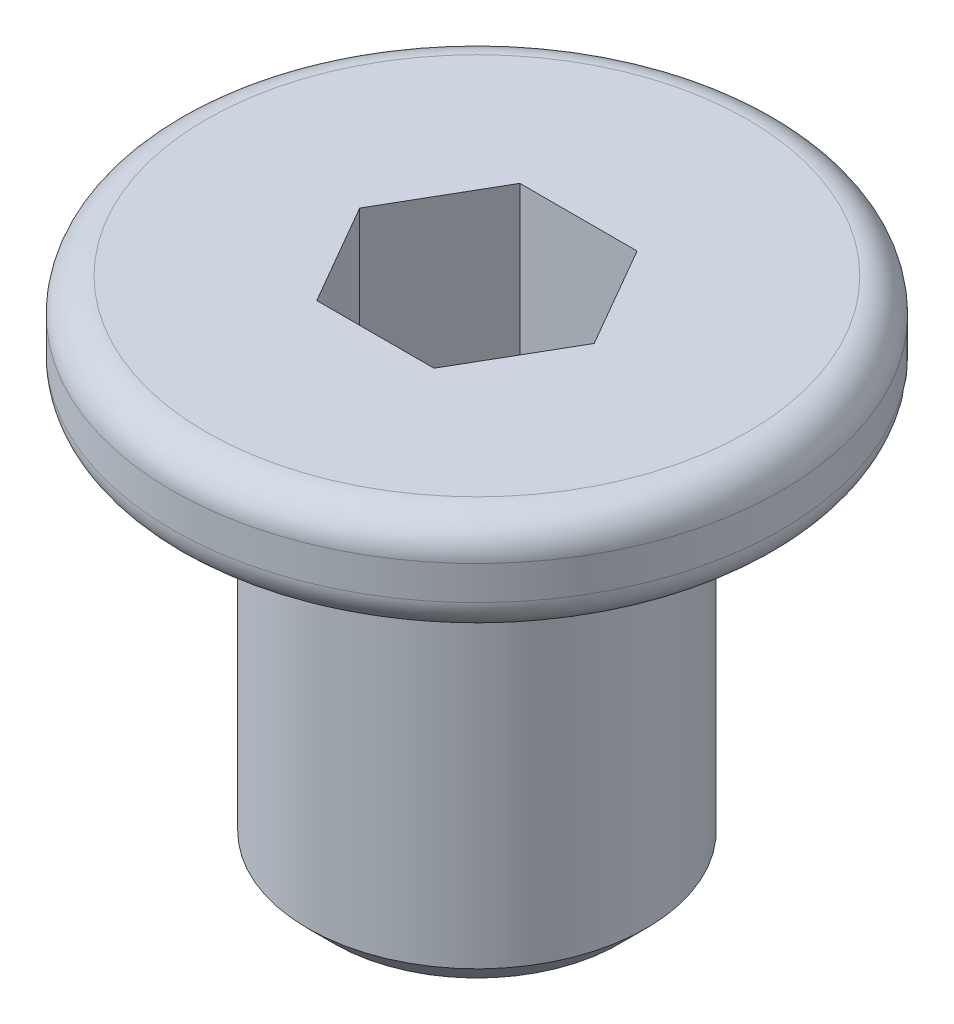
ISO-10303-21;
HEADER;
FILE_DESCRIPTION(('STEP AP214'),'2;1');
FILE_NAME('part.step','',(''),(''),'','','');
FILE_SCHEMA(('AUTOMOTIVE_DESIGN { 1 0 10303 214 1 1 1 1 }'));
ENDSEC;
DATA;
#1=APPLICATION_CONTEXT('core data for automotive mechanical design processes');
#2=APPLICATION_PROTOCOL_DEFINITION('international standard','automotive_design',2000,#1);
#3=PRODUCT_CONTEXT('',#1,'mechanical');
#4=PRODUCT('Part','Part','',(#3));
#5=PRODUCT_RELATED_PRODUCT_CATEGORY('part','',(#4));
#6=PRODUCT_DEFINITION_FORMATION('','',#4);
#7=PRODUCT_DEFINITION_CONTEXT('part definition',#1,'design');
#8=PRODUCT_DEFINITION('design','',#6,#7);
#9=PRODUCT_DEFINITION_SHAPE('','',#8);
#10=(LENGTH_UNIT() NAMED_UNIT(*) SI_UNIT(.MILLI.,.METRE.));
#11=(NAMED_UNIT(*) PLANE_ANGLE_UNIT() SI_UNIT($,.RADIAN.));
#12=(NAMED_UNIT(*) SI_UNIT($,.STERADIAN.) SOLID_ANGLE_UNIT());
#13=UNCERTAINTY_MEASURE_WITH_UNIT(LENGTH_MEASURE(1.E-05),#10,'distance_accuracy_value','');
#14=(GEOMETRIC_REPRESENTATION_CONTEXT(3) GLOBAL_UNCERTAINTY_ASSIGNED_CONTEXT((#13)) GLOBAL_UNIT_ASSIGNED_CONTEXT((#10,
#11,#12)) REPRESENTATION_CONTEXT('',''));
#15=CARTESIAN_POINT('',(0.,0.,0.));
#16=DIRECTION('',(0.,0.,1.));
#17=DIRECTION('',(1.,0.,0.));
#18=AXIS2_PLACEMENT_3D('',#15,#16,#17);
#19=CARTESIAN_POINT('',(0.,-1.,0.));
#20=DIRECTION('',(0.,1.,0.));
#21=DIRECTION('',(0.,0.,1.));
#22=AXIS2_PLACEMENT_3D('',#19,#20,#21);
#23=TOROIDAL_SURFACE('',#22,4.,0.5);
#24=CARTESIAN_POINT('',(0.,-1.5,0.));
#25=DIRECTION('',(0.,1.,0.));
#26=DIRECTION('',(0.,0.,1.));
#27=AXIS2_PLACEMENT_3D('',#24,#25,#26);
#28=CIRCLE('',#27,4.);
#29=CARTESIAN_POINT('',(0.,-1.5,4.));
#30=VERTEX_POINT('',#29);
#31=EDGE_CURVE('E188',#30,#30,#28,.T.);
#32=ORIENTED_EDGE('',*,*,#31,.T.);
#33=EDGE_LOOP('',(#32));
#34=FACE_BOUND('',#33,.T.);
#35=CARTESIAN_POINT('',(0.,-0.999999999999997,0.));
#36=DIRECTION('',(0.,1.,0.));
#37=DIRECTION('',(0.,0.,1.));
#38=AXIS2_PLACEMENT_3D('',#35,#36,#37);
#39=CIRCLE('',#38,4.5);
#40=CARTESIAN_POINT('',(0.,-0.999999999999997,4.5));
#41=VERTEX_POINT('',#40);
#42=EDGE_CURVE('E155',#41,#41,#39,.T.);
#43=ORIENTED_EDGE('',*,*,#42,.F.);
#44=EDGE_LOOP('',(#43));
#45=FACE_BOUND('',#44,.T.);
#46=ADVANCED_FACE('F43',(#34,#45),#23,.T.);
#47=CARTESIAN_POINT('',(-4.,-1.5,0.));
#48=DIRECTION('',(0.,-1.,0.));
#49=DIRECTION('',(0.,0.,-1.));
#50=AXIS2_PLACEMENT_3D('',#47,#48,#49);
#51=PLANE('',#50);
#52=CARTESIAN_POINT('',(0.,-1.5,0.));
#53=DIRECTION('',(0.,1.,0.));
#54=DIRECTION('',(0.,0.,1.));
#55=AXIS2_PLACEMENT_3D('',#52,#53,#54);
#56=CIRCLE('',#55,2.5);
#57=CARTESIAN_POINT('',(0.,-1.5,2.5));
#58=VERTEX_POINT('',#57);
#59=EDGE_CURVE('E185',#58,#58,#56,.T.);
#60=ORIENTED_EDGE('',*,*,#59,.T.);
#61=EDGE_LOOP('',(#60));
#62=FACE_BOUND('',#61,.T.);
#63=ORIENTED_EDGE('',*,*,#31,.F.);
#64=EDGE_LOOP('',(#63));
#65=FACE_BOUND('',#64,.T.);
#66=ADVANCED_FACE('F248',(#62,#65),#51,.T.);
#67=CARTESIAN_POINT('',(0.,2.75,0.));
#68=DIRECTION('',(0.,1.,0.));
#69=DIRECTION('',(0.,0.,1.));
#70=AXIS2_PLACEMENT_3D('',#67,#68,#69);
#71=CYLINDRICAL_SURFACE('',#70,2.5);
#72=CARTESIAN_POINT('',(0.,-7.1,0.));
#73=DIRECTION('',(0.,1.,0.));
#74=DIRECTION('',(0.,0.,1.));
#75=AXIS2_PLACEMENT_3D('',#72,#73,#74);
#76=CIRCLE('',#75,2.5);
#77=CARTESIAN_POINT('',(0.,-7.1,2.5));
#78=VERTEX_POINT('',#77);
#79=EDGE_CURVE('E182',#78,#78,#76,.T.);
#80=ORIENTED_EDGE('',*,*,#79,.T.);
#81=EDGE_LOOP('',(#80));
#82=FACE_BOUND('',#81,.T.);
#83=ORIENTED_EDGE('',*,*,#59,.F.);
#84=EDGE_LOOP('',(#83));
#85=FACE_BOUND('',#84,.T.);
#86=ADVANCED_FACE('F253',(#82,#85),#71,.T.);
#87=CARTESIAN_POINT('',(0.,-7.1,0.));
#88=DIRECTION('',(0.,1.,0.));
#89=DIRECTION('',(0.,0.,1.));
#90=AXIS2_PLACEMENT_3D('',#87,#88,#89);
#91=CONICAL_SURFACE('',#90,2.5,0.785398163397448);
#92=CARTESIAN_POINT('',(0.,-7.5,0.));
#93=DIRECTION('',(0.,1.,0.));
#94=DIRECTION('',(0.,0.,1.));
#95=AXIS2_PLACEMENT_3D('',#92,#93,#94);
#96=CIRCLE('',#95,2.1);
#97=CARTESIAN_POINT('',(0.,-7.5,2.1));
#98=VERTEX_POINT('',#97);
#99=EDGE_CURVE('E178',#98,#98,#96,.T.);
#100=ORIENTED_EDGE('',*,*,#99,.T.);
#101=EDGE_LOOP('',(#100));
#102=FACE_BOUND('',#101,.T.);
#103=ORIENTED_EDGE('',*,*,#79,.F.);
#104=EDGE_LOOP('',(#103));
#105=FACE_BOUND('',#104,.T.);
#106=ADVANCED_FACE('F279',(#102,#105),#91,.T.);
#107=CARTESIAN_POINT('',(-2.1,-7.5,0.));
#108=DIRECTION('',(0.,-1.,0.));
#109=DIRECTION('',(0.,0.,-1.));
#110=AXIS2_PLACEMENT_3D('',#107,#108,#109);
#111=PLANE('',#110);
#112=ORIENTED_EDGE('',*,*,#99,.F.);
#113=EDGE_LOOP('',(#112));
#114=FACE_BOUND('',#113,.T.);
#115=ADVANCED_FACE('F273',(#114),#111,.T.);
#116=CARTESIAN_POINT('',(-4.,0.,0.));
#117=DIRECTION('',(0.,1.,0.));
#118=DIRECTION('',(0.,0.,1.));
#119=AXIS2_PLACEMENT_3D('',#116,#117,#118);
#120=PLANE('',#119);
#121=DIRECTION('',(-1.,0.,0.));
#122=VECTOR('',#121,1.);
#123=CARTESIAN_POINT('',(-4.,0.,-1.5));
#124=LINE('',#123,#122);
#125=CARTESIAN_POINT('',(0.866025403784437,0.,-1.5));
#126=VERTEX_POINT('',#125);
#127=CARTESIAN_POINT('',(-0.866025403784439,0.,-1.5));
#128=VERTEX_POINT('',#127);
#129=EDGE_CURVE('E11',#126,#128,#124,.T.);
#130=ORIENTED_EDGE('',*,*,#129,.F.);
#131=DIRECTION('',(-0.500000000000001,0.,-0.866025403784438));
#132=VECTOR('',#131,1.);
#133=CARTESIAN_POINT('',(0.299038105676656,0.,-2.48205080756888));
#134=LINE('',#133,#132);
#135=CARTESIAN_POINT('',(1.73205080756888,0.,0.));
#136=VERTEX_POINT('',#135);
#137=EDGE_CURVE('E50',#136,#126,#134,.T.);
#138=ORIENTED_EDGE('',*,*,#137,.F.);
#139=DIRECTION('',(0.5,0.,-0.866025403784439));
#140=VECTOR('',#139,1.);
#141=CARTESIAN_POINT('',(0.299038105676658,0.,2.48205080756888));
#142=LINE('',#141,#140);
#143=CARTESIAN_POINT('',(0.866025403784438,0.,1.5));
#144=VERTEX_POINT('',#143);
#145=EDGE_CURVE('E193',#144,#136,#142,.T.);
#146=ORIENTED_EDGE('',*,*,#145,.F.);
#147=DIRECTION('',(1.,0.,0.));
#148=VECTOR('',#147,1.);
#149=CARTESIAN_POINT('',(-4.,0.,1.5));
#150=LINE('',#149,#148);
#151=CARTESIAN_POINT('',(-0.866025403784438,0.,1.5));
#152=VERTEX_POINT('',#151);
#153=EDGE_CURVE('E191',#152,#144,#150,.T.);
#154=ORIENTED_EDGE('',*,*,#153,.F.);
#155=DIRECTION('',(0.5,0.,0.866025403784439));
#156=VECTOR('',#155,1.);
#157=CARTESIAN_POINT('',(-2.29903810567666,0.,-0.982050807568876));
#158=LINE('',#157,#156);
#159=CARTESIAN_POINT('',(-1.73205080756888,0.,0.));
#160=VERTEX_POINT('',#159);
#161=EDGE_CURVE('E126',#160,#152,#158,.T.);
#162=ORIENTED_EDGE('',*,*,#161,.F.);
#163=DIRECTION('',(-0.5,0.,0.866025403784439));
#164=VECTOR('',#163,1.);
#165=CARTESIAN_POINT('',(-2.29903810567666,0.,0.982050807568876));
#166=LINE('',#165,#164);
#167=EDGE_CURVE('E196',#128,#160,#166,.T.);
#168=ORIENTED_EDGE('',*,*,#167,.F.);
#169=EDGE_LOOP('',(#130,#138,#146,#154,#162,#168));
#170=FACE_BOUND('',#169,.T.);
#171=CARTESIAN_POINT('',(0.,0.,0.));
#172=DIRECTION('',(0.,1.,0.));
#173=DIRECTION('',(0.,0.,1.));
#174=AXIS2_PLACEMENT_3D('',#171,#172,#173);
#175=CIRCLE('',#174,4.);
#176=CARTESIAN_POINT('',(0.,0.,4.));
#177=VERTEX_POINT('',#176);
#178=EDGE_CURVE('E172',#177,#177,#175,.T.);
#179=ORIENTED_EDGE('',*,*,#178,.T.);
#180=EDGE_LOOP('',(#179));
#181=FACE_BOUND('',#180,.T.);
#182=ADVANCED_FACE('F268',(#170,#181),#120,.T.);
#183=CARTESIAN_POINT('',(0.,-0.5,0.));
#184=DIRECTION('',(0.,1.,0.));
#185=DIRECTION('',(0.,0.,1.));
#186=AXIS2_PLACEMENT_3D('',#183,#184,#185);
#187=TOROIDAL_SURFACE('',#186,4.,0.5);
#188=CARTESIAN_POINT('',(0.,-0.500000000000003,0.));
#189=DIRECTION('',(0.,1.,0.));
#190=DIRECTION('',(0.,0.,1.));
#191=AXIS2_PLACEMENT_3D('',#188,#189,#190);
#192=CIRCLE('',#191,4.5);
#193=CARTESIAN_POINT('',(0.,-0.500000000000003,4.5));
#194=VERTEX_POINT('',#193);
#195=EDGE_CURVE('E169',#194,#194,#192,.T.);
#196=ORIENTED_EDGE('',*,*,#195,.T.);
#197=EDGE_LOOP('',(#196));
#198=FACE_BOUND('',#197,.T.);
#199=ORIENTED_EDGE('',*,*,#178,.F.);
#200=EDGE_LOOP('',(#199));
#201=FACE_BOUND('',#200,.T.);
#202=ADVANCED_FACE('F262',(#198,#201),#187,.T.);
#203=CARTESIAN_POINT('',(0.,2.75,0.));
#204=DIRECTION('',(0.,1.,0.));
#205=DIRECTION('',(0.,0.,1.));
#206=AXIS2_PLACEMENT_3D('',#203,#204,#205);
#207=CYLINDRICAL_SURFACE('',#206,4.5);
#208=ORIENTED_EDGE('',*,*,#42,.T.);
#209=EDGE_LOOP('',(#208));
#210=FACE_BOUND('',#209,.T.);
#211=ORIENTED_EDGE('',*,*,#195,.F.);
#212=EDGE_LOOP('',(#211));
#213=FACE_BOUND('',#212,.T.);
#214=ADVANCED_FACE('F259',(#210,#213),#207,.T.);
#215=CARTESIAN_POINT('',(0.,-3.,0.));
#216=DIRECTION('',(0.,1.,0.));
#217=DIRECTION('',(0.,0.,1.));
#218=AXIS2_PLACEMENT_3D('',#215,#216,#217);
#219=PLANE('',#218);
#220=DIRECTION('',(1.,0.,0.));
#221=VECTOR('',#220,1.);
#222=CARTESIAN_POINT('',(-0.866025403784438,-3.,1.5));
#223=LINE('',#222,#221);
#224=CARTESIAN_POINT('',(0.,-3.,1.5));
#225=VERTEX_POINT('',#224);
#226=CARTESIAN_POINT('',(0.866025403784438,-3.,1.5));
#227=VERTEX_POINT('',#226);
#228=EDGE_CURVE('E134',#225,#227,#223,.T.);
#229=ORIENTED_EDGE('',*,*,#228,.T.);
#230=DIRECTION('',(0.5,0.,-0.866025403784438));
#231=VECTOR('',#230,1.);
#232=CARTESIAN_POINT('',(0.866025403784438,-3.,1.5));
#233=LINE('',#232,#231);
#234=CARTESIAN_POINT('',(1.29903810567666,-3.,0.750000000000001));
#235=VERTEX_POINT('',#234);
#236=EDGE_CURVE('E138',#227,#235,#233,.T.);
#237=ORIENTED_EDGE('',*,*,#236,.T.);
#238=CARTESIAN_POINT('',(0.,-3.,0.));
#239=DIRECTION('',(0.,1.,0.));
#240=DIRECTION('',(0.,0.,1.));
#241=AXIS2_PLACEMENT_3D('',#238,#239,#240);
#242=CIRCLE('',#241,1.5);
#243=EDGE_CURVE('E175',#225,#235,#242,.T.);
#244=ORIENTED_EDGE('',*,*,#243,.F.);
#245=EDGE_LOOP('',(#229,#237,#244));
#246=FACE_BOUND('',#245,.T.);
#247=ADVANCED_FACE('F227',(#246),#219,.T.);
#248=CARTESIAN_POINT('',(1.73205080756888,-3.,0.));
#249=VERTEX_POINT('',#248);
#250=EDGE_CURVE('E136',#235,#249,#233,.T.);
#251=ORIENTED_EDGE('',*,*,#250,.T.);
#252=DIRECTION('',(-0.500000000000001,0.,-0.866025403784438));
#253=VECTOR('',#252,1.);
#254=CARTESIAN_POINT('',(1.73205080756888,-3.,0.));
#255=LINE('',#254,#253);
#256=CARTESIAN_POINT('',(1.29903810567666,-3.,-0.750000000000001));
#257=VERTEX_POINT('',#256);
#258=EDGE_CURVE('E143',#249,#257,#255,.T.);
#259=ORIENTED_EDGE('',*,*,#258,.T.);
#260=EDGE_CURVE('E179',#235,#257,#242,.T.);
#261=ORIENTED_EDGE('',*,*,#260,.F.);
#262=EDGE_LOOP('',(#251,#259,#261));
#263=FACE_BOUND('',#262,.T.);
#264=ADVANCED_FACE('F220',(#263),#219,.T.);
#265=CARTESIAN_POINT('',(0.866025403784437,-3.,-1.5));
#266=VERTEX_POINT('',#265);
#267=EDGE_CURVE('E142',#257,#266,#255,.T.);
#268=ORIENTED_EDGE('',*,*,#267,.T.);
#269=DIRECTION('',(-1.,0.,0.));
#270=VECTOR('',#269,1.);
#271=CARTESIAN_POINT('',(0.866025403784437,-3.,-1.5));
#272=LINE('',#271,#270);
#273=CARTESIAN_POINT('',(0.,-3.,-1.5));
#274=VERTEX_POINT('',#273);
#275=EDGE_CURVE('E147',#266,#274,#272,.T.);
#276=ORIENTED_EDGE('',*,*,#275,.T.);
#277=EDGE_CURVE('E216',#257,#274,#242,.T.);
#278=ORIENTED_EDGE('',*,*,#277,.F.);
#279=EDGE_LOOP('',(#268,#276,#278));
#280=FACE_BOUND('',#279,.T.);
#281=ADVANCED_FACE('F234',(#280),#219,.T.);
#282=CARTESIAN_POINT('',(-0.866025403784439,-3.,-1.5));
#283=VERTEX_POINT('',#282);
#284=EDGE_CURVE('E146',#274,#283,#272,.T.);
#285=ORIENTED_EDGE('',*,*,#284,.T.);
#286=DIRECTION('',(-0.5,0.,0.866025403784439));
#287=VECTOR('',#286,1.);
#288=CARTESIAN_POINT('',(-0.866025403784439,-3.,-1.5));
#289=LINE('',#288,#287);
#290=CARTESIAN_POINT('',(-1.29903810567666,-3.,-0.75));
#291=VERTEX_POINT('',#290);
#292=EDGE_CURVE('E130',#283,#291,#289,.T.);
#293=ORIENTED_EDGE('',*,*,#292,.T.);
#294=EDGE_CURVE('E215',#274,#291,#242,.T.);
#295=ORIENTED_EDGE('',*,*,#294,.F.);
#296=EDGE_LOOP('',(#285,#293,#295));
#297=FACE_BOUND('',#296,.T.);
#298=ADVANCED_FACE('F239',(#297),#219,.T.);
#299=CARTESIAN_POINT('',(-1.73205080756888,-3.,0.));
#300=VERTEX_POINT('',#299);
#301=EDGE_CURVE('E150',#291,#300,#289,.T.);
#302=ORIENTED_EDGE('',*,*,#301,.T.);
#303=DIRECTION('',(0.5,0.,0.866025403784438));
#304=VECTOR('',#303,1.);
#305=CARTESIAN_POINT('',(-1.73205080756888,-3.,0.));
#306=LINE('',#305,#304);
#307=CARTESIAN_POINT('',(-1.29903810567666,-3.,0.75));
#308=VERTEX_POINT('',#307);
#309=EDGE_CURVE('E119',#300,#308,#306,.T.);
#310=ORIENTED_EDGE('',*,*,#309,.T.);
#311=EDGE_CURVE('E210',#291,#308,#242,.T.);
#312=ORIENTED_EDGE('',*,*,#311,.F.);
#313=EDGE_LOOP('',(#302,#310,#312));
#314=FACE_BOUND('',#313,.T.);
#315=ADVANCED_FACE('F209',(#314),#219,.T.);
#316=CARTESIAN_POINT('',(-1.73205080756888,-3.,0.));
#317=DIRECTION('',(-0.866025403784438,0.,0.5));
#318=DIRECTION('',(0.5,0.,0.866025403784439));
#319=AXIS2_PLACEMENT_3D('',#316,#317,#318);
#320=PLANE('',#319);
#321=ORIENTED_EDGE('',*,*,#309,.F.);
#322=DIRECTION('',(0.,1.,0.));
#323=VECTOR('',#322,1.);
#324=CARTESIAN_POINT('',(-1.73205080756888,-3.,0.));
#325=LINE('',#324,#323);
#326=EDGE_CURVE('E153',#300,#160,#325,.T.);
#327=ORIENTED_EDGE('',*,*,#326,.T.);
#328=ORIENTED_EDGE('',*,*,#161,.T.);
#329=DIRECTION('',(0.,1.,0.));
#330=VECTOR('',#329,1.);
#331=CARTESIAN_POINT('',(-0.866025403784438,-3.,1.5));
#332=LINE('',#331,#330);
#333=CARTESIAN_POINT('',(-0.866025403784438,-3.,1.5));
#334=VERTEX_POINT('',#333);
#335=EDGE_CURVE('E123',#334,#152,#332,.T.);
#336=ORIENTED_EDGE('',*,*,#335,.F.);
#337=EDGE_CURVE('E111',#308,#334,#306,.T.);
#338=ORIENTED_EDGE('',*,*,#337,.F.);
#339=EDGE_LOOP('',(#321,#327,#328,#336,#338));
#340=FACE_BOUND('',#339,.T.);
#341=ADVANCED_FACE('F124',(#340),#320,.F.);
#342=CARTESIAN_POINT('',(-0.866025403784439,-3.,-1.5));
#343=DIRECTION('',(-0.866025403784439,0.,-0.5));
#344=DIRECTION('',(-0.5,0.,0.866025403784439));
#345=AXIS2_PLACEMENT_3D('',#342,#343,#344);
#346=PLANE('',#345);
#347=ORIENTED_EDGE('',*,*,#292,.F.);
#348=DIRECTION('',(0.,1.,0.));
#349=VECTOR('',#348,1.);
#350=CARTESIAN_POINT('',(-0.866025403784439,-3.,-1.5));
#351=LINE('',#350,#349);
#352=EDGE_CURVE('E156',#283,#128,#351,.T.);
#353=ORIENTED_EDGE('',*,*,#352,.T.);
#354=ORIENTED_EDGE('',*,*,#167,.T.);
#355=ORIENTED_EDGE('',*,*,#326,.F.);
#356=ORIENTED_EDGE('',*,*,#301,.F.);
#357=EDGE_LOOP('',(#347,#353,#354,#355,#356));
#358=FACE_BOUND('',#357,.T.);
#359=ADVANCED_FACE('F203',(#358),#346,.F.);
#360=CARTESIAN_POINT('',(0.866025403784437,-3.,-1.5));
#361=DIRECTION('',(0.,0.,-1.));
#362=DIRECTION('',(-1.,0.,0.));
#363=AXIS2_PLACEMENT_3D('',#360,#361,#362);
#364=PLANE('',#363);
#365=ORIENTED_EDGE('',*,*,#275,.F.);
#366=DIRECTION('',(0.,1.,0.));
#367=VECTOR('',#366,1.);
#368=CARTESIAN_POINT('',(0.866025403784437,-3.,-1.5));
#369=LINE('',#368,#367);
#370=EDGE_CURVE('E159',#266,#126,#369,.T.);
#371=ORIENTED_EDGE('',*,*,#370,.T.);
#372=ORIENTED_EDGE('',*,*,#129,.T.);
#373=ORIENTED_EDGE('',*,*,#352,.F.);
#374=ORIENTED_EDGE('',*,*,#284,.F.);
#375=EDGE_LOOP('',(#365,#371,#372,#373,#374));
#376=FACE_BOUND('',#375,.T.);
#377=ADVANCED_FACE('F237',(#376),#364,.F.);
#378=CARTESIAN_POINT('',(1.73205080756888,-3.,0.));
#379=DIRECTION('',(0.866025403784438,0.,-0.5));
#380=DIRECTION('',(-0.500000000000001,0.,-0.866025403784438));
#381=AXIS2_PLACEMENT_3D('',#378,#379,#380);
#382=PLANE('',#381);
#383=ORIENTED_EDGE('',*,*,#258,.F.);
#384=DIRECTION('',(0.,1.,0.));
#385=VECTOR('',#384,1.);
#386=CARTESIAN_POINT('',(1.73205080756888,-3.,0.));
#387=LINE('',#386,#385);
#388=EDGE_CURVE('E162',#249,#136,#387,.T.);
#389=ORIENTED_EDGE('',*,*,#388,.T.);
#390=ORIENTED_EDGE('',*,*,#137,.T.);
#391=ORIENTED_EDGE('',*,*,#370,.F.);
#392=ORIENTED_EDGE('',*,*,#267,.F.);
#393=EDGE_LOOP('',(#383,#389,#390,#391,#392));
#394=FACE_BOUND('',#393,.T.);
#395=ADVANCED_FACE('F229',(#394),#382,.F.);
#396=CARTESIAN_POINT('',(0.866025403784438,-3.,1.5));
#397=DIRECTION('',(0.866025403784438,0.,0.5));
#398=DIRECTION('',(0.5,0.,-0.866025403784439));
#399=AXIS2_PLACEMENT_3D('',#396,#397,#398);
#400=PLANE('',#399);
#401=ORIENTED_EDGE('',*,*,#236,.F.);
#402=DIRECTION('',(0.,1.,0.));
#403=VECTOR('',#402,1.);
#404=CARTESIAN_POINT('',(0.866025403784438,-3.,1.5));
#405=LINE('',#404,#403);
#406=EDGE_CURVE('E129',#227,#144,#405,.T.);
#407=ORIENTED_EDGE('',*,*,#406,.T.);
#408=ORIENTED_EDGE('',*,*,#145,.T.);
#409=ORIENTED_EDGE('',*,*,#388,.F.);
#410=ORIENTED_EDGE('',*,*,#250,.F.);
#411=EDGE_LOOP('',(#401,#407,#408,#409,#410));
#412=FACE_BOUND('',#411,.T.);
#413=ADVANCED_FACE('F225',(#412),#400,.F.);
#414=CARTESIAN_POINT('',(-0.866025403784438,-3.,1.5));
#415=DIRECTION('',(0.,0.,1.));
#416=DIRECTION('',(1.,0.,0.));
#417=AXIS2_PLACEMENT_3D('',#414,#415,#416);
#418=PLANE('',#417);
#419=EDGE_CURVE('E57',#334,#225,#223,.T.);
#420=ORIENTED_EDGE('',*,*,#419,.F.);
#421=ORIENTED_EDGE('',*,*,#335,.T.);
#422=ORIENTED_EDGE('',*,*,#153,.T.);
#423=ORIENTED_EDGE('',*,*,#406,.F.);
#424=ORIENTED_EDGE('',*,*,#228,.F.);
#425=EDGE_LOOP('',(#420,#421,#422,#423,#424));
#426=FACE_BOUND('',#425,.T.);
#427=ADVANCED_FACE('F132',(#426),#418,.F.);
#428=ORIENTED_EDGE('',*,*,#337,.T.);
#429=ORIENTED_EDGE('',*,*,#419,.T.);
#430=EDGE_CURVE('E115',#308,#225,#242,.T.);
#431=ORIENTED_EDGE('',*,*,#430,.F.);
#432=EDGE_LOOP('',(#428,#429,#431));
#433=FACE_BOUND('',#432,.T.);
#434=ADVANCED_FACE('F113',(#433),#219,.T.);
#435=CARTESIAN_POINT('',(0.,-4.,0.));
#436=DIRECTION('',(0.,1.,0.));
#437=DIRECTION('',(0.,0.,1.));
#438=AXIS2_PLACEMENT_3D('',#435,#436,#437);
#439=CONICAL_SURFACE('',#438,0.,0.982793723247329);
#440=ORIENTED_EDGE('',*,*,#243,.T.);
#441=ORIENTED_EDGE('',*,*,#260,.T.);
#442=ORIENTED_EDGE('',*,*,#277,.T.);
#443=ORIENTED_EDGE('',*,*,#294,.T.);
#444=ORIENTED_EDGE('',*,*,#311,.T.);
#445=ORIENTED_EDGE('',*,*,#430,.T.);
#446=EDGE_LOOP('',(#440,#441,#442,#443,#444,#445));
#447=FACE_BOUND('',#446,.T.);
#448=CARTESIAN_POINT('',(0.,-4.,0.));
#449=VERTEX_POINT('',#448);
#450=VERTEX_LOOP('',#449);
#451=FACE_BOUND('',#450,.T.);
#452=ADVANCED_FACE('F213',(#447,#451),#439,.F.);
#453=CLOSED_SHELL('',(#46,#66,#86,#106,#115,#182,#202,#214,#247,#264,#281,#298,#315,#341,#359,
#377,#395,#413,#427,#434,#452));
#454=MANIFOLD_SOLID_BREP('B2',#453);
#455=ADVANCED_BREP_SHAPE_REPRESENTATION('',(#18,#454),#14);
#456=SHAPE_DEFINITION_REPRESENTATION(#9,#455);
ENDSEC;
END-ISO-10303-21;
